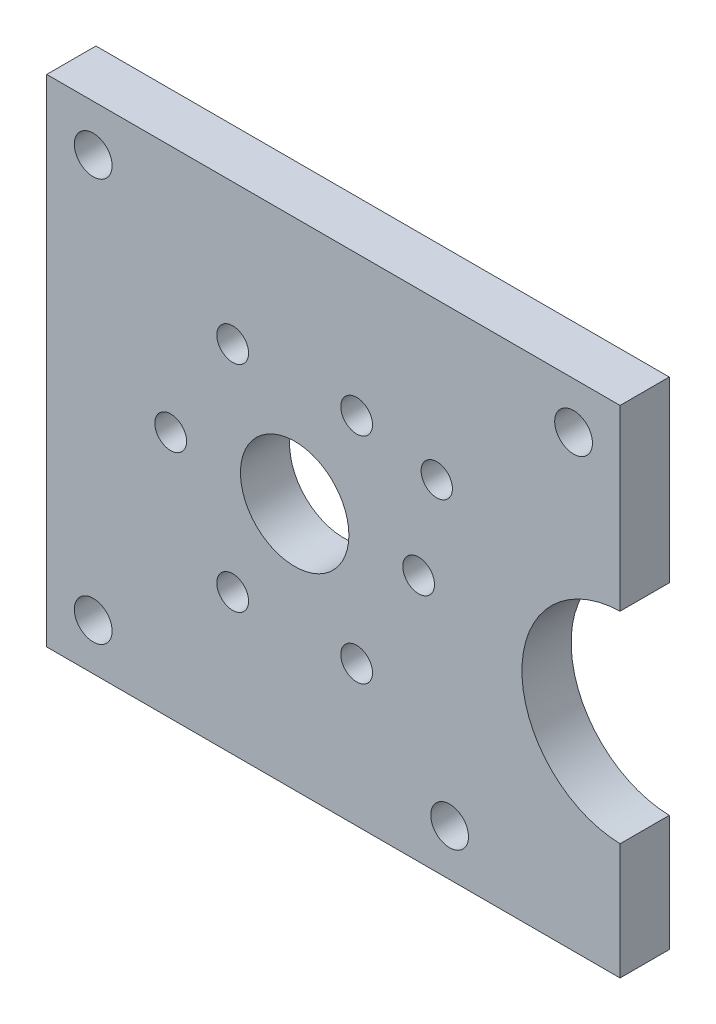
ISO-10303-21;
HEADER;
FILE_DESCRIPTION(('STEP AP214'),'2;1');
FILE_NAME('part.step','',(''),(''),'','','');
FILE_SCHEMA(('AUTOMOTIVE_DESIGN { 1 0 10303 214 1 1 1 1 }'));
ENDSEC;
DATA;
#1=APPLICATION_CONTEXT('core data for automotive mechanical design processes');
#2=APPLICATION_PROTOCOL_DEFINITION('international standard','automotive_design',2000,#1);
#3=PRODUCT_CONTEXT('',#1,'mechanical');
#4=PRODUCT('Part','Part','',(#3));
#5=PRODUCT_RELATED_PRODUCT_CATEGORY('part','',(#4));
#6=PRODUCT_DEFINITION_FORMATION('','',#4);
#7=PRODUCT_DEFINITION_CONTEXT('part definition',#1,'design');
#8=PRODUCT_DEFINITION('design','',#6,#7);
#9=PRODUCT_DEFINITION_SHAPE('','',#8);
#10=(LENGTH_UNIT() NAMED_UNIT(*) SI_UNIT(.MILLI.,.METRE.));
#11=(NAMED_UNIT(*) PLANE_ANGLE_UNIT() SI_UNIT($,.RADIAN.));
#12=(NAMED_UNIT(*) SI_UNIT($,.STERADIAN.) SOLID_ANGLE_UNIT());
#13=UNCERTAINTY_MEASURE_WITH_UNIT(LENGTH_MEASURE(1.E-05),#10,'distance_accuracy_value','');
#14=(GEOMETRIC_REPRESENTATION_CONTEXT(3) GLOBAL_UNCERTAINTY_ASSIGNED_CONTEXT((#13)) GLOBAL_UNIT_ASSIGNED_CONTEXT((#10,
#11,#12)) REPRESENTATION_CONTEXT('',''));
#15=CARTESIAN_POINT('',(0.,0.,0.));
#16=DIRECTION('',(0.,0.,1.));
#17=DIRECTION('',(1.,0.,0.));
#18=AXIS2_PLACEMENT_3D('',#15,#16,#17);
#19=CARTESIAN_POINT('',(37.1666992956996,14.,3.175));
#20=DIRECTION('',(0.,0.,1.));
#21=DIRECTION('',(1.,0.,0.));
#22=AXIS2_PLACEMENT_3D('',#19,#20,#21);
#23=PLANE('',#22);
#24=CARTESIAN_POINT('',(8.,16.,3.175));
#25=DIRECTION('',(0.,0.,1.));
#26=DIRECTION('',(1.,0.,0.));
#27=AXIS2_PLACEMENT_3D('',#24,#25,#26);
#28=CIRCLE('',#27,1.02499999999999);
#29=CARTESIAN_POINT('',(9.02499999999999,16.,3.175));
#30=VERTEX_POINT('',#29);
#31=EDGE_CURVE('E250',#30,#30,#28,.T.);
#32=ORIENTED_EDGE('',*,*,#31,.F.);
#33=EDGE_LOOP('',(#32));
#34=FACE_BOUND('',#33,.T.);
#35=CARTESIAN_POINT('',(12.,22.9282032302755,3.175));
#36=DIRECTION('',(0.,0.,1.));
#37=DIRECTION('',(1.,0.,0.));
#38=AXIS2_PLACEMENT_3D('',#35,#36,#37);
#39=CIRCLE('',#38,1.02499999999999);
#40=CARTESIAN_POINT('',(13.025,22.9282032302755,3.175));
#41=VERTEX_POINT('',#40);
#42=EDGE_CURVE('E252',#41,#41,#39,.T.);
#43=ORIENTED_EDGE('',*,*,#42,.F.);
#44=EDGE_LOOP('',(#43));
#45=FACE_BOUND('',#44,.T.);
#46=CARTESIAN_POINT('',(20.,22.9282032302755,3.175));
#47=DIRECTION('',(0.,0.,1.));
#48=DIRECTION('',(1.,0.,0.));
#49=AXIS2_PLACEMENT_3D('',#46,#47,#48);
#50=CIRCLE('',#49,1.02499999999999);
#51=CARTESIAN_POINT('',(21.025,22.9282032302755,3.175));
#52=VERTEX_POINT('',#51);
#53=EDGE_CURVE('E260',#52,#52,#50,.T.);
#54=ORIENTED_EDGE('',*,*,#53,.F.);
#55=EDGE_LOOP('',(#54));
#56=FACE_BOUND('',#55,.T.);
#57=CARTESIAN_POINT('',(24.,15.9999999999999,3.175));
#58=DIRECTION('',(0.,0.,1.));
#59=DIRECTION('',(1.,0.,0.));
#60=AXIS2_PLACEMENT_3D('',#57,#58,#59);
#61=CIRCLE('',#60,1.02499999999999);
#62=CARTESIAN_POINT('',(25.025,15.9999999999999,3.175));
#63=VERTEX_POINT('',#62);
#64=EDGE_CURVE('E266',#63,#63,#61,.T.);
#65=ORIENTED_EDGE('',*,*,#64,.F.);
#66=EDGE_LOOP('',(#65));
#67=FACE_BOUND('',#66,.T.);
#68=CARTESIAN_POINT('',(19.9999999999999,9.07179676972445,3.175));
#69=DIRECTION('',(0.,0.,1.));
#70=DIRECTION('',(1.,0.,0.));
#71=AXIS2_PLACEMENT_3D('',#68,#69,#70);
#72=CIRCLE('',#71,1.02499999999999);
#73=CARTESIAN_POINT('',(21.0249999999999,9.07179676972445,3.175));
#74=VERTEX_POINT('',#73);
#75=EDGE_CURVE('E272',#74,#74,#72,.T.);
#76=ORIENTED_EDGE('',*,*,#75,.F.);
#77=EDGE_LOOP('',(#76));
#78=FACE_BOUND('',#77,.T.);
#79=CARTESIAN_POINT('',(11.9999999999999,9.07179676972453,3.175));
#80=DIRECTION('',(0.,0.,1.));
#81=DIRECTION('',(1.,0.,0.));
#82=AXIS2_PLACEMENT_3D('',#79,#80,#81);
#83=CIRCLE('',#82,1.02499999999999);
#84=CARTESIAN_POINT('',(13.0249999999999,9.07179676972453,3.175));
#85=VERTEX_POINT('',#84);
#86=EDGE_CURVE('E278',#85,#85,#83,.T.);
#87=ORIENTED_EDGE('',*,*,#86,.F.);
#88=EDGE_LOOP('',(#87));
#89=FACE_BOUND('',#88,.T.);
#90=CARTESIAN_POINT('',(3.,29.,3.175));
#91=DIRECTION('',(0.,0.,1.));
#92=DIRECTION('',(1.,0.,0.));
#93=AXIS2_PLACEMENT_3D('',#90,#91,#92);
#94=CIRCLE('',#93,1.21919999999999);
#95=CARTESIAN_POINT('',(4.21919999999999,29.,3.175));
#96=VERTEX_POINT('',#95);
#97=EDGE_CURVE('E284',#96,#96,#94,.T.);
#98=ORIENTED_EDGE('',*,*,#97,.F.);
#99=EDGE_LOOP('',(#98));
#100=FACE_BOUND('',#99,.T.);
#101=CARTESIAN_POINT('',(3.,3.,3.175));
#102=DIRECTION('',(0.,0.,1.));
#103=DIRECTION('',(1.,0.,0.));
#104=AXIS2_PLACEMENT_3D('',#101,#102,#103);
#105=CIRCLE('',#104,1.21919999999999);
#106=CARTESIAN_POINT('',(4.21919999999999,3.,3.175));
#107=VERTEX_POINT('',#106);
#108=EDGE_CURVE('E290',#107,#107,#105,.T.);
#109=ORIENTED_EDGE('',*,*,#108,.F.);
#110=EDGE_LOOP('',(#109));
#111=FACE_BOUND('',#110,.T.);
#112=CARTESIAN_POINT('',(34.,29.,3.175));
#113=DIRECTION('',(0.,0.,1.));
#114=DIRECTION('',(1.,0.,0.));
#115=AXIS2_PLACEMENT_3D('',#112,#113,#114);
#116=CIRCLE('',#115,1.21919999999999);
#117=CARTESIAN_POINT('',(35.2192,29.,3.175));
#118=VERTEX_POINT('',#117);
#119=EDGE_CURVE('E156',#118,#118,#116,.T.);
#120=ORIENTED_EDGE('',*,*,#119,.F.);
#121=EDGE_LOOP('',(#120));
#122=FACE_BOUND('',#121,.T.);
#123=CARTESIAN_POINT('',(26.,3.,3.175));
#124=DIRECTION('',(0.,0.,1.));
#125=DIRECTION('',(1.,0.,0.));
#126=AXIS2_PLACEMENT_3D('',#123,#124,#125);
#127=CIRCLE('',#126,1.21919999999999);
#128=CARTESIAN_POINT('',(27.2192,3.,3.175));
#129=VERTEX_POINT('',#128);
#130=EDGE_CURVE('E145',#129,#129,#127,.T.);
#131=ORIENTED_EDGE('',*,*,#130,.F.);
#132=EDGE_LOOP('',(#131));
#133=FACE_BOUND('',#132,.T.);
#134=CARTESIAN_POINT('',(25.1697789659621,21.9334001816327,3.175));
#135=DIRECTION('',(0.,0.,1.));
#136=DIRECTION('',(1.,0.,0.));
#137=AXIS2_PLACEMENT_3D('',#134,#135,#136);
#138=CIRCLE('',#137,1.01);
#139=CARTESIAN_POINT('',(26.1797789659621,21.9334001816327,3.175));
#140=VERTEX_POINT('',#139);
#141=EDGE_CURVE('E130',#140,#140,#138,.T.);
#142=ORIENTED_EDGE('',*,*,#141,.F.);
#143=EDGE_LOOP('',(#142));
#144=FACE_BOUND('',#143,.T.);
#145=DIRECTION('',(0.,-1.,0.));
#146=VECTOR('',#145,1.);
#147=CARTESIAN_POINT('',(0.,0.,3.175));
#148=LINE('',#147,#146);
#149=CARTESIAN_POINT('',(0.,32.,3.175));
#150=VERTEX_POINT('',#149);
#151=CARTESIAN_POINT('',(0.,0.,3.175));
#152=VERTEX_POINT('',#151);
#153=EDGE_CURVE('E137',#150,#152,#148,.T.);
#154=ORIENTED_EDGE('',*,*,#153,.T.);
#155=DIRECTION('',(1.,0.,0.));
#156=VECTOR('',#155,1.);
#157=CARTESIAN_POINT('',(0.,0.,3.175));
#158=LINE('',#157,#156);
#159=CARTESIAN_POINT('',(37.,0.,3.175));
#160=VERTEX_POINT('',#159);
#161=EDGE_CURVE('E95',#152,#160,#158,.T.);
#162=ORIENTED_EDGE('',*,*,#161,.T.);
#163=DIRECTION('',(0.,1.,0.));
#164=VECTOR('',#163,1.);
#165=CARTESIAN_POINT('',(37.,7.50213794045971,3.175));
#166=LINE('',#165,#164);
#167=CARTESIAN_POINT('',(37.,7.50213794045971,3.175));
#168=VERTEX_POINT('',#167);
#169=EDGE_CURVE('E108',#160,#168,#166,.T.);
#170=ORIENTED_EDGE('',*,*,#169,.T.);
#171=CARTESIAN_POINT('',(37.1666992956996,14.,3.175));
#172=DIRECTION('',(0.,0.,-1.));
#173=DIRECTION('',(1.,0.,0.));
#174=AXIS2_PLACEMENT_3D('',#171,#172,#173);
#175=CIRCLE('',#174,6.5);
#176=CARTESIAN_POINT('',(37.,20.4978620595403,3.175));
#177=VERTEX_POINT('',#176);
#178=EDGE_CURVE('E102',#168,#177,#175,.T.);
#179=ORIENTED_EDGE('',*,*,#178,.T.);
#180=DIRECTION('',(0.,1.,0.));
#181=VECTOR('',#180,1.);
#182=CARTESIAN_POINT('',(37.,20.4978620595403,3.175));
#183=LINE('',#182,#181);
#184=CARTESIAN_POINT('',(37.,32.,3.175));
#185=VERTEX_POINT('',#184);
#186=EDGE_CURVE('E106',#177,#185,#183,.T.);
#187=ORIENTED_EDGE('',*,*,#186,.T.);
#188=DIRECTION('',(-1.,0.,0.));
#189=VECTOR('',#188,1.);
#190=CARTESIAN_POINT('',(0.,32.,3.175));
#191=LINE('',#190,#189);
#192=EDGE_CURVE('E58',#185,#150,#191,.T.);
#193=ORIENTED_EDGE('',*,*,#192,.T.);
#194=EDGE_LOOP('',(#154,#162,#170,#179,#187,#193));
#195=FACE_BOUND('',#194,.T.);
#196=CARTESIAN_POINT('',(16.,16.,3.175));
#197=DIRECTION('',(0.,0.,1.));
#198=DIRECTION('',(1.,0.,0.));
#199=AXIS2_PLACEMENT_3D('',#196,#197,#198);
#200=CIRCLE('',#199,3.5);
#201=CARTESIAN_POINT('',(19.5,16.,3.175));
#202=VERTEX_POINT('',#201);
#203=EDGE_CURVE('E149',#202,#202,#200,.T.);
#204=ORIENTED_EDGE('',*,*,#203,.F.);
#205=EDGE_LOOP('',(#204));
#206=FACE_BOUND('',#205,.T.);
#207=ADVANCED_FACE('F39',(#34,#45,#56,#67,#78,#89,#100,#111,#122,#133,#144,#195,#206),#23,.T.);
#208=CARTESIAN_POINT('',(37.1666992956996,14.,0.));
#209=DIRECTION('',(0.,0.,1.));
#210=DIRECTION('',(1.,0.,0.));
#211=AXIS2_PLACEMENT_3D('',#208,#209,#210);
#212=PLANE('',#211);
#213=CARTESIAN_POINT('',(8.,16.,0.));
#214=DIRECTION('',(0.,0.,1.));
#215=DIRECTION('',(1.,0.,0.));
#216=AXIS2_PLACEMENT_3D('',#213,#214,#215);
#217=CIRCLE('',#216,1.025);
#218=CARTESIAN_POINT('',(9.025,16.,0.));
#219=VERTEX_POINT('',#218);
#220=EDGE_CURVE('E248',#219,#219,#217,.T.);
#221=ORIENTED_EDGE('',*,*,#220,.T.);
#222=EDGE_LOOP('',(#221));
#223=FACE_BOUND('',#222,.T.);
#224=CARTESIAN_POINT('',(12.,22.9282032302755,0.));
#225=DIRECTION('',(0.,0.,1.));
#226=DIRECTION('',(1.,0.,0.));
#227=AXIS2_PLACEMENT_3D('',#224,#225,#226);
#228=CIRCLE('',#227,1.025);
#229=CARTESIAN_POINT('',(13.025,22.9282032302755,0.));
#230=VERTEX_POINT('',#229);
#231=EDGE_CURVE('E257',#230,#230,#228,.T.);
#232=ORIENTED_EDGE('',*,*,#231,.T.);
#233=EDGE_LOOP('',(#232));
#234=FACE_BOUND('',#233,.T.);
#235=CARTESIAN_POINT('',(20.,22.9282032302755,0.));
#236=DIRECTION('',(0.,0.,1.));
#237=DIRECTION('',(1.,0.,0.));
#238=AXIS2_PLACEMENT_3D('',#235,#236,#237);
#239=CIRCLE('',#238,1.025);
#240=CARTESIAN_POINT('',(21.025,22.9282032302755,0.));
#241=VERTEX_POINT('',#240);
#242=EDGE_CURVE('E263',#241,#241,#239,.T.);
#243=ORIENTED_EDGE('',*,*,#242,.T.);
#244=EDGE_LOOP('',(#243));
#245=FACE_BOUND('',#244,.T.);
#246=CARTESIAN_POINT('',(24.,15.9999999999999,0.));
#247=DIRECTION('',(0.,0.,1.));
#248=DIRECTION('',(1.,0.,0.));
#249=AXIS2_PLACEMENT_3D('',#246,#247,#248);
#250=CIRCLE('',#249,1.025);
#251=CARTESIAN_POINT('',(25.025,15.9999999999999,0.));
#252=VERTEX_POINT('',#251);
#253=EDGE_CURVE('E269',#252,#252,#250,.T.);
#254=ORIENTED_EDGE('',*,*,#253,.T.);
#255=EDGE_LOOP('',(#254));
#256=FACE_BOUND('',#255,.T.);
#257=CARTESIAN_POINT('',(19.9999999999999,9.07179676972445,0.));
#258=DIRECTION('',(0.,0.,1.));
#259=DIRECTION('',(1.,0.,0.));
#260=AXIS2_PLACEMENT_3D('',#257,#258,#259);
#261=CIRCLE('',#260,1.025);
#262=CARTESIAN_POINT('',(21.0249999999999,9.07179676972445,0.));
#263=VERTEX_POINT('',#262);
#264=EDGE_CURVE('E275',#263,#263,#261,.T.);
#265=ORIENTED_EDGE('',*,*,#264,.T.);
#266=EDGE_LOOP('',(#265));
#267=FACE_BOUND('',#266,.T.);
#268=CARTESIAN_POINT('',(11.9999999999999,9.07179676972453,0.));
#269=DIRECTION('',(0.,0.,1.));
#270=DIRECTION('',(1.,0.,0.));
#271=AXIS2_PLACEMENT_3D('',#268,#269,#270);
#272=CIRCLE('',#271,1.025);
#273=CARTESIAN_POINT('',(13.0249999999999,9.07179676972453,0.));
#274=VERTEX_POINT('',#273);
#275=EDGE_CURVE('E281',#274,#274,#272,.T.);
#276=ORIENTED_EDGE('',*,*,#275,.T.);
#277=EDGE_LOOP('',(#276));
#278=FACE_BOUND('',#277,.T.);
#279=CARTESIAN_POINT('',(3.,29.,0.));
#280=DIRECTION('',(0.,0.,1.));
#281=DIRECTION('',(1.,0.,0.));
#282=AXIS2_PLACEMENT_3D('',#279,#280,#281);
#283=CIRCLE('',#282,1.21919999999999);
#284=CARTESIAN_POINT('',(4.21919999999999,29.,0.));
#285=VERTEX_POINT('',#284);
#286=EDGE_CURVE('E287',#285,#285,#283,.T.);
#287=ORIENTED_EDGE('',*,*,#286,.T.);
#288=EDGE_LOOP('',(#287));
#289=FACE_BOUND('',#288,.T.);
#290=CARTESIAN_POINT('',(3.,3.,0.));
#291=DIRECTION('',(0.,0.,1.));
#292=DIRECTION('',(1.,0.,0.));
#293=AXIS2_PLACEMENT_3D('',#290,#291,#292);
#294=CIRCLE('',#293,1.21919999999999);
#295=CARTESIAN_POINT('',(4.21919999999999,3.,0.));
#296=VERTEX_POINT('',#295);
#297=EDGE_CURVE('E292',#296,#296,#294,.T.);
#298=ORIENTED_EDGE('',*,*,#297,.T.);
#299=EDGE_LOOP('',(#298));
#300=FACE_BOUND('',#299,.T.);
#301=CARTESIAN_POINT('',(34.,29.,0.));
#302=DIRECTION('',(0.,0.,1.));
#303=DIRECTION('',(1.,0.,0.));
#304=AXIS2_PLACEMENT_3D('',#301,#302,#303);
#305=CIRCLE('',#304,1.21919999999999);
#306=CARTESIAN_POINT('',(35.2192,29.,0.));
#307=VERTEX_POINT('',#306);
#308=EDGE_CURVE('E43',#307,#307,#305,.T.);
#309=ORIENTED_EDGE('',*,*,#308,.T.);
#310=EDGE_LOOP('',(#309));
#311=FACE_BOUND('',#310,.T.);
#312=CARTESIAN_POINT('',(26.,3.,0.));
#313=DIRECTION('',(0.,0.,1.));
#314=DIRECTION('',(1.,0.,0.));
#315=AXIS2_PLACEMENT_3D('',#312,#313,#314);
#316=CIRCLE('',#315,1.21919999999999);
#317=CARTESIAN_POINT('',(27.2192,3.,0.));
#318=VERTEX_POINT('',#317);
#319=EDGE_CURVE('E142',#318,#318,#316,.T.);
#320=ORIENTED_EDGE('',*,*,#319,.T.);
#321=EDGE_LOOP('',(#320));
#322=FACE_BOUND('',#321,.T.);
#323=CARTESIAN_POINT('',(25.1697789659621,21.9334001816327,0.));
#324=DIRECTION('',(0.,0.,1.));
#325=DIRECTION('',(1.,0.,0.));
#326=AXIS2_PLACEMENT_3D('',#323,#324,#325);
#327=CIRCLE('',#326,1.01);
#328=CARTESIAN_POINT('',(26.1797789659621,21.9334001816327,0.));
#329=VERTEX_POINT('',#328);
#330=EDGE_CURVE('E161',#329,#329,#327,.T.);
#331=ORIENTED_EDGE('',*,*,#330,.T.);
#332=EDGE_LOOP('',(#331));
#333=FACE_BOUND('',#332,.T.);
#334=DIRECTION('',(0.,-1.,0.));
#335=VECTOR('',#334,1.);
#336=CARTESIAN_POINT('',(0.,0.,0.));
#337=LINE('',#336,#335);
#338=CARTESIAN_POINT('',(0.,32.,0.));
#339=VERTEX_POINT('',#338);
#340=CARTESIAN_POINT('',(0.,0.,0.));
#341=VERTEX_POINT('',#340);
#342=EDGE_CURVE('E126',#339,#341,#337,.T.);
#343=ORIENTED_EDGE('',*,*,#342,.F.);
#344=DIRECTION('',(-1.,0.,0.));
#345=VECTOR('',#344,1.);
#346=CARTESIAN_POINT('',(0.,32.,0.));
#347=LINE('',#346,#345);
#348=CARTESIAN_POINT('',(37.,32.,0.));
#349=VERTEX_POINT('',#348);
#350=EDGE_CURVE('E87',#349,#339,#347,.T.);
#351=ORIENTED_EDGE('',*,*,#350,.F.);
#352=DIRECTION('',(0.,1.,0.));
#353=VECTOR('',#352,1.);
#354=CARTESIAN_POINT('',(37.,20.4978620595403,0.));
#355=LINE('',#354,#353);
#356=CARTESIAN_POINT('',(37.,20.4978620595403,0.));
#357=VERTEX_POINT('',#356);
#358=EDGE_CURVE('E81',#357,#349,#355,.T.);
#359=ORIENTED_EDGE('',*,*,#358,.F.);
#360=CARTESIAN_POINT('',(37.1666992956996,14.,0.));
#361=DIRECTION('',(0.,0.,-1.));
#362=DIRECTION('',(1.,0.,0.));
#363=AXIS2_PLACEMENT_3D('',#360,#361,#362);
#364=CIRCLE('',#363,6.5);
#365=CARTESIAN_POINT('',(37.,7.50213794045971,0.));
#366=VERTEX_POINT('',#365);
#367=EDGE_CURVE('E116',#366,#357,#364,.T.);
#368=ORIENTED_EDGE('',*,*,#367,.F.);
#369=DIRECTION('',(0.,1.,0.));
#370=VECTOR('',#369,1.);
#371=CARTESIAN_POINT('',(37.,7.50213794045971,0.));
#372=LINE('',#371,#370);
#373=CARTESIAN_POINT('',(37.,0.,0.));
#374=VERTEX_POINT('',#373);
#375=EDGE_CURVE('E132',#374,#366,#372,.T.);
#376=ORIENTED_EDGE('',*,*,#375,.F.);
#377=DIRECTION('',(1.,0.,0.));
#378=VECTOR('',#377,1.);
#379=CARTESIAN_POINT('',(0.,0.,0.));
#380=LINE('',#379,#378);
#381=EDGE_CURVE('E129',#341,#374,#380,.T.);
#382=ORIENTED_EDGE('',*,*,#381,.F.);
#383=EDGE_LOOP('',(#343,#351,#359,#368,#376,#382));
#384=FACE_BOUND('',#383,.T.);
#385=CARTESIAN_POINT('',(16.,16.,0.));
#386=DIRECTION('',(0.,0.,1.));
#387=DIRECTION('',(1.,0.,0.));
#388=AXIS2_PLACEMENT_3D('',#385,#386,#387);
#389=CIRCLE('',#388,3.5);
#390=CARTESIAN_POINT('',(19.5,16.,0.));
#391=VERTEX_POINT('',#390);
#392=EDGE_CURVE('E144',#391,#391,#389,.T.);
#393=ORIENTED_EDGE('',*,*,#392,.T.);
#394=EDGE_LOOP('',(#393));
#395=FACE_BOUND('',#394,.T.);
#396=ADVANCED_FACE('F176',(#223,#234,#245,#256,#267,#278,#289,#300,#311,#322,#333,#384,#395),
#212,.F.);
#397=CARTESIAN_POINT('',(0.,0.,3.175));
#398=DIRECTION('',(1.,0.,0.));
#399=DIRECTION('',(0.,1.,0.));
#400=AXIS2_PLACEMENT_3D('',#397,#398,#399);
#401=PLANE('',#400);
#402=ORIENTED_EDGE('',*,*,#342,.T.);
#403=DIRECTION('',(0.,0.,-1.));
#404=VECTOR('',#403,1.);
#405=CARTESIAN_POINT('',(0.,0.,3.175));
#406=LINE('',#405,#404);
#407=EDGE_CURVE('E11',#152,#341,#406,.T.);
#408=ORIENTED_EDGE('',*,*,#407,.F.);
#409=ORIENTED_EDGE('',*,*,#153,.F.);
#410=DIRECTION('',(0.,0.,-1.));
#411=VECTOR('',#410,1.);
#412=CARTESIAN_POINT('',(0.,32.,3.175));
#413=LINE('',#412,#411);
#414=EDGE_CURVE('E122',#150,#339,#413,.T.);
#415=ORIENTED_EDGE('',*,*,#414,.T.);
#416=EDGE_LOOP('',(#402,#408,#409,#415));
#417=FACE_BOUND('',#416,.T.);
#418=ADVANCED_FACE('F41',(#417),#401,.F.);
#419=CARTESIAN_POINT('',(0.,0.,3.175));
#420=DIRECTION('',(0.,1.,0.));
#421=DIRECTION('',(0.,0.,1.));
#422=AXIS2_PLACEMENT_3D('',#419,#420,#421);
#423=PLANE('',#422);
#424=ORIENTED_EDGE('',*,*,#381,.T.);
#425=DIRECTION('',(0.,0.,-1.));
#426=VECTOR('',#425,1.);
#427=CARTESIAN_POINT('',(37.,0.,3.175));
#428=LINE('',#427,#426);
#429=EDGE_CURVE('E49',#160,#374,#428,.T.);
#430=ORIENTED_EDGE('',*,*,#429,.F.);
#431=ORIENTED_EDGE('',*,*,#161,.F.);
#432=ORIENTED_EDGE('',*,*,#407,.T.);
#433=EDGE_LOOP('',(#424,#430,#431,#432));
#434=FACE_BOUND('',#433,.T.);
#435=ADVANCED_FACE('F170',(#434),#423,.F.);
#436=CARTESIAN_POINT('',(37.,7.50213794045971,3.175));
#437=DIRECTION('',(-1.,0.,0.));
#438=DIRECTION('',(0.,0.,1.));
#439=AXIS2_PLACEMENT_3D('',#436,#437,#438);
#440=PLANE('',#439);
#441=ORIENTED_EDGE('',*,*,#375,.T.);
#442=DIRECTION('',(0.,0.,-1.));
#443=VECTOR('',#442,1.);
#444=CARTESIAN_POINT('',(37.,7.50213794045971,3.175));
#445=LINE('',#444,#443);
#446=EDGE_CURVE('E117',#168,#366,#445,.T.);
#447=ORIENTED_EDGE('',*,*,#446,.F.);
#448=ORIENTED_EDGE('',*,*,#169,.F.);
#449=ORIENTED_EDGE('',*,*,#429,.T.);
#450=EDGE_LOOP('',(#441,#447,#448,#449));
#451=FACE_BOUND('',#450,.T.);
#452=ADVANCED_FACE('F173',(#451),#440,.F.);
#453=CARTESIAN_POINT('',(37.1666992956996,14.,3.175));
#454=DIRECTION('',(0.,0.,-1.));
#455=DIRECTION('',(-1.,0.,0.));
#456=AXIS2_PLACEMENT_3D('',#453,#454,#455);
#457=CYLINDRICAL_SURFACE('',#456,6.5);
#458=ORIENTED_EDGE('',*,*,#367,.T.);
#459=DIRECTION('',(0.,0.,-1.));
#460=VECTOR('',#459,1.);
#461=CARTESIAN_POINT('',(37.,20.4978620595403,3.175));
#462=LINE('',#461,#460);
#463=EDGE_CURVE('E113',#177,#357,#462,.T.);
#464=ORIENTED_EDGE('',*,*,#463,.F.);
#465=ORIENTED_EDGE('',*,*,#178,.F.);
#466=ORIENTED_EDGE('',*,*,#446,.T.);
#467=EDGE_LOOP('',(#458,#464,#465,#466));
#468=FACE_BOUND('',#467,.T.);
#469=ADVANCED_FACE('F114',(#468),#457,.F.);
#470=CARTESIAN_POINT('',(37.,20.4978620595403,3.175));
#471=DIRECTION('',(-1.,0.,0.));
#472=DIRECTION('',(0.,0.,1.));
#473=AXIS2_PLACEMENT_3D('',#470,#471,#472);
#474=PLANE('',#473);
#475=ORIENTED_EDGE('',*,*,#358,.T.);
#476=DIRECTION('',(0.,0.,-1.));
#477=VECTOR('',#476,1.);
#478=CARTESIAN_POINT('',(37.,32.,3.175));
#479=LINE('',#478,#477);
#480=EDGE_CURVE('E118',#185,#349,#479,.T.);
#481=ORIENTED_EDGE('',*,*,#480,.F.);
#482=ORIENTED_EDGE('',*,*,#186,.F.);
#483=ORIENTED_EDGE('',*,*,#463,.T.);
#484=EDGE_LOOP('',(#475,#481,#482,#483));
#485=FACE_BOUND('',#484,.T.);
#486=ADVANCED_FACE('F120',(#485),#474,.F.);
#487=CARTESIAN_POINT('',(0.,32.,3.175));
#488=DIRECTION('',(0.,-1.,0.));
#489=DIRECTION('',(1.,0.,0.));
#490=AXIS2_PLACEMENT_3D('',#487,#488,#489);
#491=PLANE('',#490);
#492=ORIENTED_EDGE('',*,*,#350,.T.);
#493=ORIENTED_EDGE('',*,*,#414,.F.);
#494=ORIENTED_EDGE('',*,*,#192,.F.);
#495=ORIENTED_EDGE('',*,*,#480,.T.);
#496=EDGE_LOOP('',(#492,#493,#494,#495));
#497=FACE_BOUND('',#496,.T.);
#498=ADVANCED_FACE('F179',(#497),#491,.F.);
#499=CARTESIAN_POINT('',(25.1697789659621,21.9334001816327,3.175));
#500=DIRECTION('',(0.,0.,-1.));
#501=DIRECTION('',(-1.,0.,0.));
#502=AXIS2_PLACEMENT_3D('',#499,#500,#501);
#503=CYLINDRICAL_SURFACE('',#502,1.01);
#504=ORIENTED_EDGE('',*,*,#141,.T.);
#505=EDGE_LOOP('',(#504));
#506=FACE_BOUND('',#505,.T.);
#507=ORIENTED_EDGE('',*,*,#330,.F.);
#508=EDGE_LOOP('',(#507));
#509=FACE_BOUND('',#508,.T.);
#510=ADVANCED_FACE('F181',(#506,#509),#503,.F.);
#511=CARTESIAN_POINT('',(16.,16.,3.175));
#512=DIRECTION('',(0.,0.,-1.));
#513=DIRECTION('',(-1.,0.,0.));
#514=AXIS2_PLACEMENT_3D('',#511,#512,#513);
#515=CYLINDRICAL_SURFACE('',#514,3.5);
#516=ORIENTED_EDGE('',*,*,#203,.T.);
#517=EDGE_LOOP('',(#516));
#518=FACE_BOUND('',#517,.T.);
#519=ORIENTED_EDGE('',*,*,#392,.F.);
#520=EDGE_LOOP('',(#519));
#521=FACE_BOUND('',#520,.T.);
#522=ADVANCED_FACE('F187',(#518,#521),#515,.F.);
#523=CARTESIAN_POINT('',(26.,3.,3.175));
#524=DIRECTION('',(0.,0.,1.));
#525=DIRECTION('',(1.,0.,0.));
#526=AXIS2_PLACEMENT_3D('',#523,#524,#525);
#527=CYLINDRICAL_SURFACE('',#526,1.21919999999999);
#528=ORIENTED_EDGE('',*,*,#130,.T.);
#529=EDGE_LOOP('',(#528));
#530=FACE_BOUND('',#529,.T.);
#531=ORIENTED_EDGE('',*,*,#319,.F.);
#532=EDGE_LOOP('',(#531));
#533=FACE_BOUND('',#532,.T.);
#534=ADVANCED_FACE('F204',(#530,#533),#527,.F.);
#535=CARTESIAN_POINT('',(34.,29.,3.175));
#536=DIRECTION('',(0.,0.,1.));
#537=DIRECTION('',(1.,0.,0.));
#538=AXIS2_PLACEMENT_3D('',#535,#536,#537);
#539=CYLINDRICAL_SURFACE('',#538,1.21919999999999);
#540=ORIENTED_EDGE('',*,*,#119,.T.);
#541=EDGE_LOOP('',(#540));
#542=FACE_BOUND('',#541,.T.);
#543=ORIENTED_EDGE('',*,*,#308,.F.);
#544=EDGE_LOOP('',(#543));
#545=FACE_BOUND('',#544,.T.);
#546=ADVANCED_FACE('F208',(#542,#545),#539,.F.);
#547=CARTESIAN_POINT('',(3.,3.,3.175));
#548=DIRECTION('',(0.,0.,1.));
#549=DIRECTION('',(1.,0.,0.));
#550=AXIS2_PLACEMENT_3D('',#547,#548,#549);
#551=CYLINDRICAL_SURFACE('',#550,1.21919999999999);
#552=ORIENTED_EDGE('',*,*,#108,.T.);
#553=EDGE_LOOP('',(#552));
#554=FACE_BOUND('',#553,.T.);
#555=ORIENTED_EDGE('',*,*,#297,.F.);
#556=EDGE_LOOP('',(#555));
#557=FACE_BOUND('',#556,.T.);
#558=ADVANCED_FACE('F211',(#554,#557),#551,.F.);
#559=CARTESIAN_POINT('',(3.,29.,3.175));
#560=DIRECTION('',(0.,0.,1.));
#561=DIRECTION('',(1.,0.,0.));
#562=AXIS2_PLACEMENT_3D('',#559,#560,#561);
#563=CYLINDRICAL_SURFACE('',#562,1.21919999999999);
#564=ORIENTED_EDGE('',*,*,#97,.T.);
#565=EDGE_LOOP('',(#564));
#566=FACE_BOUND('',#565,.T.);
#567=ORIENTED_EDGE('',*,*,#286,.F.);
#568=EDGE_LOOP('',(#567));
#569=FACE_BOUND('',#568,.T.);
#570=ADVANCED_FACE('F215',(#566,#569),#563,.F.);
#571=CARTESIAN_POINT('',(11.9999999999999,9.07179676972453,3.175));
#572=DIRECTION('',(0.,0.,1.));
#573=DIRECTION('',(1.,0.,0.));
#574=AXIS2_PLACEMENT_3D('',#571,#572,#573);
#575=CYLINDRICAL_SURFACE('',#574,1.02499999999999);
#576=ORIENTED_EDGE('',*,*,#275,.F.);
#577=EDGE_LOOP('',(#576));
#578=FACE_BOUND('',#577,.T.);
#579=ORIENTED_EDGE('',*,*,#86,.T.);
#580=EDGE_LOOP('',(#579));
#581=FACE_BOUND('',#580,.T.);
#582=ADVANCED_FACE('F219',(#578,#581),#575,.F.);
#583=CARTESIAN_POINT('',(19.9999999999999,9.07179676972445,3.175));
#584=DIRECTION('',(0.,0.,1.));
#585=DIRECTION('',(1.,0.,0.));
#586=AXIS2_PLACEMENT_3D('',#583,#584,#585);
#587=CYLINDRICAL_SURFACE('',#586,1.02499999999999);
#588=ORIENTED_EDGE('',*,*,#264,.F.);
#589=EDGE_LOOP('',(#588));
#590=FACE_BOUND('',#589,.T.);
#591=ORIENTED_EDGE('',*,*,#75,.T.);
#592=EDGE_LOOP('',(#591));
#593=FACE_BOUND('',#592,.T.);
#594=ADVANCED_FACE('F223',(#590,#593),#587,.F.);
#595=CARTESIAN_POINT('',(24.,15.9999999999999,3.175));
#596=DIRECTION('',(0.,0.,1.));
#597=DIRECTION('',(1.,0.,0.));
#598=AXIS2_PLACEMENT_3D('',#595,#596,#597);
#599=CYLINDRICAL_SURFACE('',#598,1.02499999999999);
#600=ORIENTED_EDGE('',*,*,#253,.F.);
#601=EDGE_LOOP('',(#600));
#602=FACE_BOUND('',#601,.T.);
#603=ORIENTED_EDGE('',*,*,#64,.T.);
#604=EDGE_LOOP('',(#603));
#605=FACE_BOUND('',#604,.T.);
#606=ADVANCED_FACE('F227',(#602,#605),#599,.F.);
#607=CARTESIAN_POINT('',(20.,22.9282032302755,3.175));
#608=DIRECTION('',(0.,0.,1.));
#609=DIRECTION('',(1.,0.,0.));
#610=AXIS2_PLACEMENT_3D('',#607,#608,#609);
#611=CYLINDRICAL_SURFACE('',#610,1.02499999999999);
#612=ORIENTED_EDGE('',*,*,#242,.F.);
#613=EDGE_LOOP('',(#612));
#614=FACE_BOUND('',#613,.T.);
#615=ORIENTED_EDGE('',*,*,#53,.T.);
#616=EDGE_LOOP('',(#615));
#617=FACE_BOUND('',#616,.T.);
#618=ADVANCED_FACE('F231',(#614,#617),#611,.F.);
#619=CARTESIAN_POINT('',(12.,22.9282032302755,3.175));
#620=DIRECTION('',(0.,0.,1.));
#621=DIRECTION('',(1.,0.,0.));
#622=AXIS2_PLACEMENT_3D('',#619,#620,#621);
#623=CYLINDRICAL_SURFACE('',#622,1.02499999999999);
#624=ORIENTED_EDGE('',*,*,#231,.F.);
#625=EDGE_LOOP('',(#624));
#626=FACE_BOUND('',#625,.T.);
#627=ORIENTED_EDGE('',*,*,#42,.T.);
#628=EDGE_LOOP('',(#627));
#629=FACE_BOUND('',#628,.T.);
#630=ADVANCED_FACE('F235',(#626,#629),#623,.F.);
#631=CARTESIAN_POINT('',(8.,16.,3.175));
#632=DIRECTION('',(0.,0.,1.));
#633=DIRECTION('',(1.,0.,0.));
#634=AXIS2_PLACEMENT_3D('',#631,#632,#633);
#635=CYLINDRICAL_SURFACE('',#634,1.02499999999999);
#636=ORIENTED_EDGE('',*,*,#220,.F.);
#637=EDGE_LOOP('',(#636));
#638=FACE_BOUND('',#637,.T.);
#639=ORIENTED_EDGE('',*,*,#31,.T.);
#640=EDGE_LOOP('',(#639));
#641=FACE_BOUND('',#640,.T.);
#642=ADVANCED_FACE('F239',(#638,#641),#635,.F.);
#643=CLOSED_SHELL('',(#207,#396,#418,#435,#452,#469,#486,#498,#510,#522,#534,#546,#558,#570,
#582,#594,#606,#618,#630,#642));
#644=MANIFOLD_SOLID_BREP('B2',#643);
#645=ADVANCED_BREP_SHAPE_REPRESENTATION('',(#18,#644),#14);
#646=SHAPE_DEFINITION_REPRESENTATION(#9,#645);
ENDSEC;
END-ISO-10303-21;
